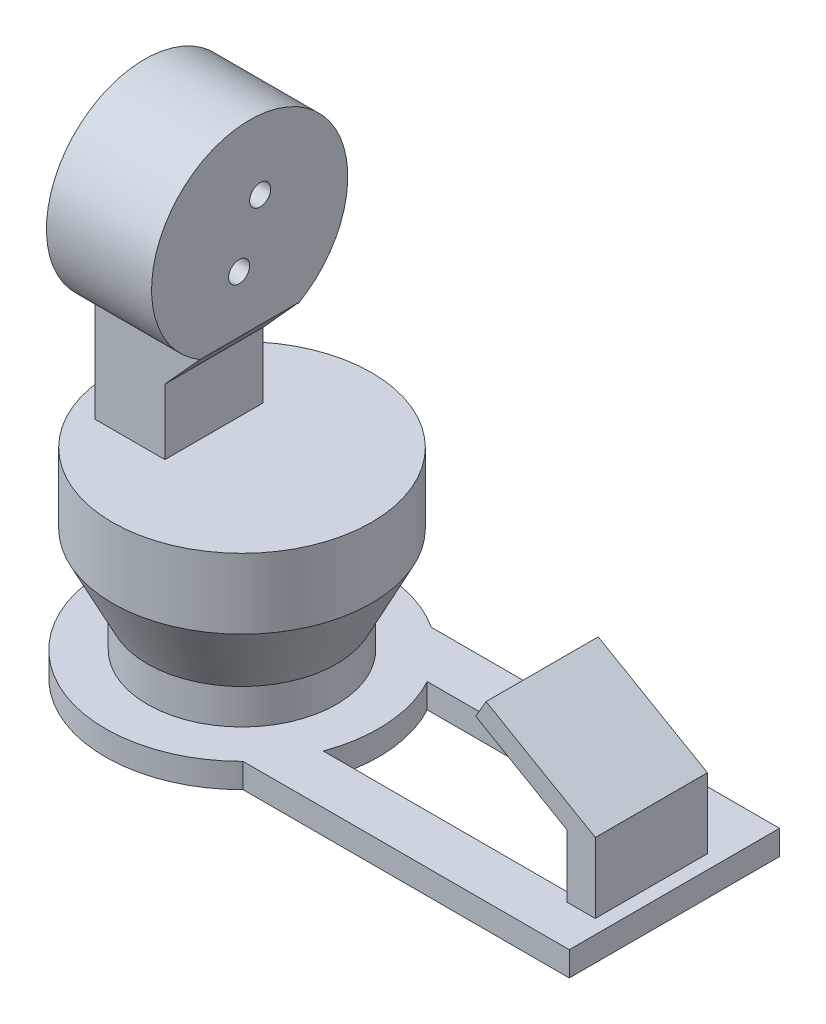
ISO-10303-21;
HEADER;
FILE_DESCRIPTION(('STEP AP214'),'2;1');
FILE_NAME('part.step','',(''),(''),'','','');
FILE_SCHEMA(('AUTOMOTIVE_DESIGN { 1 0 10303 214 1 1 1 1 }'));
ENDSEC;
DATA;
#1=APPLICATION_CONTEXT('core data for automotive mechanical design processes');
#2=APPLICATION_PROTOCOL_DEFINITION('international standard','automotive_design',2000,#1);
#3=PRODUCT_CONTEXT('',#1,'mechanical');
#4=PRODUCT('Part','Part','',(#3));
#5=PRODUCT_RELATED_PRODUCT_CATEGORY('part','',(#4));
#6=PRODUCT_DEFINITION_FORMATION('','',#4);
#7=PRODUCT_DEFINITION_CONTEXT('part definition',#1,'design');
#8=PRODUCT_DEFINITION('design','',#6,#7);
#9=PRODUCT_DEFINITION_SHAPE('','',#8);
#10=(LENGTH_UNIT() NAMED_UNIT(*) SI_UNIT(.MILLI.,.METRE.));
#11=(NAMED_UNIT(*) PLANE_ANGLE_UNIT() SI_UNIT($,.RADIAN.));
#12=(NAMED_UNIT(*) SI_UNIT($,.STERADIAN.) SOLID_ANGLE_UNIT());
#13=UNCERTAINTY_MEASURE_WITH_UNIT(LENGTH_MEASURE(1.E-05),#10,'distance_accuracy_value','');
#14=(GEOMETRIC_REPRESENTATION_CONTEXT(3) GLOBAL_UNCERTAINTY_ASSIGNED_CONTEXT((#13)) GLOBAL_UNIT_ASSIGNED_CONTEXT((#10,
#11,#12)) REPRESENTATION_CONTEXT('',''));
#15=CARTESIAN_POINT('',(0.,0.,0.));
#16=DIRECTION('',(0.,0.,1.));
#17=DIRECTION('',(1.,0.,0.));
#18=AXIS2_PLACEMENT_3D('',#15,#16,#17);
#19=CARTESIAN_POINT('',(0.,28.5,0.));
#20=DIRECTION('',(0.,1.,0.));
#21=DIRECTION('',(0.,0.,1.));
#22=AXIS2_PLACEMENT_3D('',#19,#20,#21);
#23=PLANE('',#22);
#24=CARTESIAN_POINT('',(0.,28.5,0.));
#25=DIRECTION('',(0.,1.,0.));
#26=DIRECTION('',(0.,0.,1.));
#27=AXIS2_PLACEMENT_3D('',#24,#25,#26);
#28=CIRCLE('',#27,18.5);
#29=CARTESIAN_POINT('',(0.,28.5,18.5));
#30=VERTEX_POINT('',#29);
#31=EDGE_CURVE('E269',#30,#30,#28,.T.);
#32=ORIENTED_EDGE('',*,*,#31,.T.);
#33=EDGE_LOOP('',(#32));
#34=FACE_BOUND('',#33,.T.);
#35=DIRECTION('',(1.,0.,0.));
#36=VECTOR('',#35,1.);
#37=CARTESIAN_POINT('',(-13.9958954436756,28.5,7.));
#38=LINE('',#37,#36);
#39=CARTESIAN_POINT('',(-13.9958954436756,28.5,7.));
#40=VERTEX_POINT('',#39);
#41=CARTESIAN_POINT('',(-3.99589544367561,28.5,7.));
#42=VERTEX_POINT('',#41);
#43=EDGE_CURVE('E257',#40,#42,#38,.T.);
#44=ORIENTED_EDGE('',*,*,#43,.F.);
#45=DIRECTION('',(0.,0.,1.));
#46=VECTOR('',#45,1.);
#47=CARTESIAN_POINT('',(-13.9958954436756,28.5,-7.));
#48=LINE('',#47,#46);
#49=CARTESIAN_POINT('',(-13.9958954436756,28.5,-7.));
#50=VERTEX_POINT('',#49);
#51=EDGE_CURVE('E249',#50,#40,#48,.T.);
#52=ORIENTED_EDGE('',*,*,#51,.F.);
#53=DIRECTION('',(-1.,0.,0.));
#54=VECTOR('',#53,1.);
#55=CARTESIAN_POINT('',(-13.9958954436756,28.5,-7.));
#56=LINE('',#55,#54);
#57=CARTESIAN_POINT('',(-3.99589544367561,28.5,-7.));
#58=VERTEX_POINT('',#57);
#59=EDGE_CURVE('E254',#58,#50,#56,.T.);
#60=ORIENTED_EDGE('',*,*,#59,.F.);
#61=DIRECTION('',(0.,0.,-1.));
#62=VECTOR('',#61,1.);
#63=CARTESIAN_POINT('',(-3.99589544367561,28.5,-7.));
#64=LINE('',#63,#62);
#65=EDGE_CURVE('E259',#42,#58,#64,.T.);
#66=ORIENTED_EDGE('',*,*,#65,.F.);
#67=EDGE_LOOP('',(#44,#52,#60,#66));
#68=FACE_BOUND('',#67,.T.);
#69=ADVANCED_FACE('F40',(#34,#68),#23,.T.);
#70=CARTESIAN_POINT('',(0.,3.5,0.));
#71=DIRECTION('',(0.,-1.,0.));
#72=DIRECTION('',(0.,0.,-1.));
#73=AXIS2_PLACEMENT_3D('',#70,#71,#72);
#74=CYLINDRICAL_SURFACE('',#73,19.5);
#75=CARTESIAN_POINT('',(0.,0.,0.));
#76=DIRECTION('',(0.,1.,0.));
#77=DIRECTION('',(0.,0.,1.));
#78=AXIS2_PLACEMENT_3D('',#75,#76,#77);
#79=CIRCLE('',#78,19.5);
#80=CARTESIAN_POINT('',(10.7209559253568,0.,-16.2883732780949));
#81=VERTEX_POINT('',#80);
#82=CARTESIAN_POINT('',(13.8651106248431,0.,13.7116267219051));
#83=VERTEX_POINT('',#82);
#84=EDGE_CURVE('E472',#81,#83,#79,.T.);
#85=ORIENTED_EDGE('',*,*,#84,.T.);
#86=DIRECTION('',(0.,-1.,0.));
#87=VECTOR('',#86,1.);
#88=CARTESIAN_POINT('',(13.8651106248431,3.5,13.7116267219051));
#89=LINE('',#88,#87);
#90=CARTESIAN_POINT('',(13.8651106248431,3.5,13.7116267219051));
#91=VERTEX_POINT('',#90);
#92=EDGE_CURVE('E12',#91,#83,#89,.T.);
#93=ORIENTED_EDGE('',*,*,#92,.F.);
#94=CARTESIAN_POINT('',(0.,3.5,0.));
#95=DIRECTION('',(0.,1.,0.));
#96=DIRECTION('',(0.,0.,1.));
#97=AXIS2_PLACEMENT_3D('',#94,#95,#96);
#98=CIRCLE('',#97,19.5);
#99=CARTESIAN_POINT('',(10.7209559253568,3.5,-16.2883732780949));
#100=VERTEX_POINT('',#99);
#101=EDGE_CURVE('E490',#100,#91,#98,.T.);
#102=ORIENTED_EDGE('',*,*,#101,.F.);
#103=DIRECTION('',(0.,-1.,0.));
#104=VECTOR('',#103,1.);
#105=CARTESIAN_POINT('',(10.7209559253568,3.5,-16.2883732780949));
#106=LINE('',#105,#104);
#107=EDGE_CURVE('E448',#100,#81,#106,.T.);
#108=ORIENTED_EDGE('',*,*,#107,.T.);
#109=EDGE_LOOP('',(#85,#93,#102,#108));
#110=FACE_BOUND('',#109,.T.);
#111=ADVANCED_FACE('F320',(#110),#74,.T.);
#112=CARTESIAN_POINT('',(0.,3.5,13.7116267219051));
#113=DIRECTION('',(0.,0.,1.));
#114=DIRECTION('',(1.,0.,0.));
#115=AXIS2_PLACEMENT_3D('',#112,#113,#114);
#116=PLANE('',#115);
#117=DIRECTION('',(-1.,0.,0.));
#118=VECTOR('',#117,1.);
#119=CARTESIAN_POINT('',(0.,0.,13.7116267219051));
#120=LINE('',#119,#118);
#121=CARTESIAN_POINT('',(60.4126112827152,0.,13.7116267219051));
#122=VERTEX_POINT('',#121);
#123=EDGE_CURVE('E469',#122,#83,#120,.T.);
#124=ORIENTED_EDGE('',*,*,#123,.F.);
#125=DIRECTION('',(0.,-1.,0.));
#126=VECTOR('',#125,1.);
#127=CARTESIAN_POINT('',(60.4126112827152,3.5,13.7116267219051));
#128=LINE('',#127,#126);
#129=CARTESIAN_POINT('',(60.4126112827152,3.5,13.7116267219051));
#130=VERTEX_POINT('',#129);
#131=EDGE_CURVE('E49',#130,#122,#128,.T.);
#132=ORIENTED_EDGE('',*,*,#131,.F.);
#133=DIRECTION('',(-1.,0.,0.));
#134=VECTOR('',#133,1.);
#135=CARTESIAN_POINT('',(0.,3.5,13.7116267219051));
#136=LINE('',#135,#134);
#137=EDGE_CURVE('E487',#130,#91,#136,.T.);
#138=ORIENTED_EDGE('',*,*,#137,.T.);
#139=ORIENTED_EDGE('',*,*,#92,.T.);
#140=EDGE_LOOP('',(#124,#132,#138,#139));
#141=FACE_BOUND('',#140,.T.);
#142=ADVANCED_FACE('F316',(#141),#116,.T.);
#143=CARTESIAN_POINT('',(60.4126112827152,3.5,0.));
#144=DIRECTION('',(-1.,0.,0.));
#145=DIRECTION('',(0.,0.,1.));
#146=AXIS2_PLACEMENT_3D('',#143,#144,#145);
#147=PLANE('',#146);
#148=DIRECTION('',(0.,0.,-1.));
#149=VECTOR('',#148,1.);
#150=CARTESIAN_POINT('',(60.4126112827152,0.,0.));
#151=LINE('',#150,#149);
#152=CARTESIAN_POINT('',(60.4126112827152,0.,-16.2883732780949));
#153=VERTEX_POINT('',#152);
#154=EDGE_CURVE('E467',#122,#153,#151,.T.);
#155=ORIENTED_EDGE('',*,*,#154,.T.);
#156=DIRECTION('',(0.,-1.,0.));
#157=VECTOR('',#156,1.);
#158=CARTESIAN_POINT('',(60.4126112827152,3.5,-16.2883732780949));
#159=LINE('',#158,#157);
#160=CARTESIAN_POINT('',(60.4126112827152,3.5,-16.2883732780949));
#161=VERTEX_POINT('',#160);
#162=EDGE_CURVE('E459',#161,#153,#159,.T.);
#163=ORIENTED_EDGE('',*,*,#162,.F.);
#164=DIRECTION('',(0.,0.,-1.));
#165=VECTOR('',#164,1.);
#166=CARTESIAN_POINT('',(60.4126112827152,3.5,0.));
#167=LINE('',#166,#165);
#168=EDGE_CURVE('E485',#130,#161,#167,.T.);
#169=ORIENTED_EDGE('',*,*,#168,.F.);
#170=ORIENTED_EDGE('',*,*,#131,.T.);
#171=EDGE_LOOP('',(#155,#163,#169,#170));
#172=FACE_BOUND('',#171,.T.);
#173=ADVANCED_FACE('F313',(#172),#147,.F.);
#174=CARTESIAN_POINT('',(0.,3.5,6.71162672190509));
#175=DIRECTION('',(0.,0.,-1.));
#176=DIRECTION('',(-1.,0.,0.));
#177=AXIS2_PLACEMENT_3D('',#174,#175,#176);
#178=PLANE('',#177);
#179=DIRECTION('',(1.,0.,0.));
#180=VECTOR('',#179,1.);
#181=CARTESIAN_POINT('',(0.,0.,6.71162672190509));
#182=LINE('',#181,#180);
#183=CARTESIAN_POINT('',(18.3085790476981,0.,6.71162672190509));
#184=VERTEX_POINT('',#183);
#185=CARTESIAN_POINT('',(53.4126112827152,0.,6.71162672190509));
#186=VERTEX_POINT('',#185);
#187=EDGE_CURVE('E445',#184,#186,#182,.T.);
#188=ORIENTED_EDGE('',*,*,#187,.F.);
#189=DIRECTION('',(0.,-1.,0.));
#190=VECTOR('',#189,1.);
#191=CARTESIAN_POINT('',(18.3085790476981,3.5,6.71162672190509));
#192=LINE('',#191,#190);
#193=CARTESIAN_POINT('',(18.3085790476981,3.5,6.71162672190509));
#194=VERTEX_POINT('',#193);
#195=EDGE_CURVE('E446',#194,#184,#192,.T.);
#196=ORIENTED_EDGE('',*,*,#195,.F.);
#197=DIRECTION('',(1.,0.,0.));
#198=VECTOR('',#197,1.);
#199=CARTESIAN_POINT('',(0.,3.5,6.71162672190509));
#200=LINE('',#199,#198);
#201=CARTESIAN_POINT('',(53.4126112827152,3.5,6.71162672190509));
#202=VERTEX_POINT('',#201);
#203=EDGE_CURVE('E466',#194,#202,#200,.T.);
#204=ORIENTED_EDGE('',*,*,#203,.T.);
#205=DIRECTION('',(0.,-1.,0.));
#206=VECTOR('',#205,1.);
#207=CARTESIAN_POINT('',(53.4126112827152,3.5,6.71162672190509));
#208=LINE('',#207,#206);
#209=EDGE_CURVE('E455',#202,#186,#208,.T.);
#210=ORIENTED_EDGE('',*,*,#209,.T.);
#211=EDGE_LOOP('',(#188,#196,#204,#210));
#212=FACE_BOUND('',#211,.T.);
#213=ADVANCED_FACE('F42',(#212),#178,.T.);
#214=CARTESIAN_POINT('',(0.,3.5,0.));
#215=DIRECTION('',(0.,-1.,0.));
#216=DIRECTION('',(0.,0.,-1.));
#217=AXIS2_PLACEMENT_3D('',#214,#215,#216);
#218=CYLINDRICAL_SURFACE('',#217,19.5);
#219=CARTESIAN_POINT('',(0.,0.,0.));
#220=DIRECTION('',(0.,1.,0.));
#221=DIRECTION('',(0.,0.,1.));
#222=AXIS2_PLACEMENT_3D('',#219,#220,#221);
#223=CIRCLE('',#222,19.5);
#224=CARTESIAN_POINT('',(17.1457318842554,0.,-9.28837327809491));
#225=VERTEX_POINT('',#224);
#226=EDGE_CURVE('E480',#184,#225,#223,.T.);
#227=ORIENTED_EDGE('',*,*,#226,.T.);
#228=DIRECTION('',(0.,-1.,0.));
#229=VECTOR('',#228,1.);
#230=CARTESIAN_POINT('',(17.1457318842554,3.5,-9.28837327809491));
#231=LINE('',#230,#229);
#232=CARTESIAN_POINT('',(17.1457318842554,3.5,-9.28837327809491));
#233=VERTEX_POINT('',#232);
#234=EDGE_CURVE('E449',#233,#225,#231,.T.);
#235=ORIENTED_EDGE('',*,*,#234,.F.);
#236=CARTESIAN_POINT('',(0.,3.5,0.));
#237=DIRECTION('',(0.,1.,0.));
#238=DIRECTION('',(0.,0.,1.));
#239=AXIS2_PLACEMENT_3D('',#236,#237,#238);
#240=CIRCLE('',#239,19.5);
#241=EDGE_CURVE('E496',#194,#233,#240,.T.);
#242=ORIENTED_EDGE('',*,*,#241,.F.);
#243=ORIENTED_EDGE('',*,*,#195,.T.);
#244=EDGE_LOOP('',(#227,#235,#242,#243));
#245=FACE_BOUND('',#244,.T.);
#246=ADVANCED_FACE('F330',(#245),#218,.T.);
#247=CARTESIAN_POINT('',(0.,3.5,-9.28837327809491));
#248=DIRECTION('',(0.,0.,-1.));
#249=DIRECTION('',(-1.,0.,0.));
#250=AXIS2_PLACEMENT_3D('',#247,#248,#249);
#251=PLANE('',#250);
#252=DIRECTION('',(1.,0.,0.));
#253=VECTOR('',#252,1.);
#254=CARTESIAN_POINT('',(0.,0.,-9.28837327809491));
#255=LINE('',#254,#253);
#256=CARTESIAN_POINT('',(53.4126112827152,0.,-9.28837327809491));
#257=VERTEX_POINT('',#256);
#258=EDGE_CURVE('E478',#225,#257,#255,.T.);
#259=ORIENTED_EDGE('',*,*,#258,.T.);
#260=DIRECTION('',(0.,-1.,0.));
#261=VECTOR('',#260,1.);
#262=CARTESIAN_POINT('',(53.4126112827152,3.5,-9.28837327809491));
#263=LINE('',#262,#261);
#264=CARTESIAN_POINT('',(53.4126112827152,3.5,-9.28837327809491));
#265=VERTEX_POINT('',#264);
#266=EDGE_CURVE('E452',#265,#257,#263,.T.);
#267=ORIENTED_EDGE('',*,*,#266,.F.);
#268=DIRECTION('',(1.,0.,0.));
#269=VECTOR('',#268,1.);
#270=CARTESIAN_POINT('',(0.,3.5,-9.28837327809491));
#271=LINE('',#270,#269);
#272=EDGE_CURVE('E494',#233,#265,#271,.T.);
#273=ORIENTED_EDGE('',*,*,#272,.F.);
#274=ORIENTED_EDGE('',*,*,#234,.T.);
#275=EDGE_LOOP('',(#259,#267,#273,#274));
#276=FACE_BOUND('',#275,.T.);
#277=ADVANCED_FACE('F327',(#276),#251,.F.);
#278=CARTESIAN_POINT('',(53.4126112827152,3.5,0.));
#279=DIRECTION('',(1.,0.,0.));
#280=DIRECTION('',(0.,0.,-1.));
#281=AXIS2_PLACEMENT_3D('',#278,#279,#280);
#282=PLANE('',#281);
#283=DIRECTION('',(0.,0.,1.));
#284=VECTOR('',#283,1.);
#285=CARTESIAN_POINT('',(53.4126112827152,0.,0.));
#286=LINE('',#285,#284);
#287=EDGE_CURVE('E475',#257,#186,#286,.T.);
#288=ORIENTED_EDGE('',*,*,#287,.T.);
#289=ORIENTED_EDGE('',*,*,#209,.F.);
#290=DIRECTION('',(0.,0.,1.));
#291=VECTOR('',#290,1.);
#292=CARTESIAN_POINT('',(53.4126112827152,3.5,0.));
#293=LINE('',#292,#291);
#294=EDGE_CURVE('E492',#265,#202,#293,.T.);
#295=ORIENTED_EDGE('',*,*,#294,.F.);
#296=ORIENTED_EDGE('',*,*,#266,.T.);
#297=EDGE_LOOP('',(#288,#289,#295,#296));
#298=FACE_BOUND('',#297,.T.);
#299=ADVANCED_FACE('F311',(#298),#282,.F.);
#300=CARTESIAN_POINT('',(0.,3.5,-16.2883732780949));
#301=DIRECTION('',(0.,0.,1.));
#302=DIRECTION('',(1.,0.,0.));
#303=AXIS2_PLACEMENT_3D('',#300,#301,#302);
#304=PLANE('',#303);
#305=DIRECTION('',(-1.,0.,0.));
#306=VECTOR('',#305,1.);
#307=CARTESIAN_POINT('',(0.,0.,-16.2883732780949));
#308=LINE('',#307,#306);
#309=EDGE_CURVE('E464',#153,#81,#308,.T.);
#310=ORIENTED_EDGE('',*,*,#309,.T.);
#311=ORIENTED_EDGE('',*,*,#107,.F.);
#312=DIRECTION('',(-1.,0.,0.));
#313=VECTOR('',#312,1.);
#314=CARTESIAN_POINT('',(0.,3.5,-16.2883732780949));
#315=LINE('',#314,#313);
#316=EDGE_CURVE('E456',#161,#100,#315,.T.);
#317=ORIENTED_EDGE('',*,*,#316,.F.);
#318=ORIENTED_EDGE('',*,*,#162,.T.);
#319=EDGE_LOOP('',(#310,#311,#317,#318));
#320=FACE_BOUND('',#319,.T.);
#321=ADVANCED_FACE('F304',(#320),#304,.F.);
#322=CARTESIAN_POINT('',(0.,3.5,0.));
#323=DIRECTION('',(0.,1.,0.));
#324=DIRECTION('',(0.,0.,1.));
#325=AXIS2_PLACEMENT_3D('',#322,#323,#324);
#326=PLANE('',#325);
#327=DIRECTION('',(1.,0.,0.));
#328=VECTOR('',#327,1.);
#329=CARTESIAN_POINT('',(58.4126112827152,3.5,8.));
#330=LINE('',#329,#328);
#331=CARTESIAN_POINT('',(54.4126112827152,3.5,8.));
#332=VERTEX_POINT('',#331);
#333=CARTESIAN_POINT('',(58.4126112827152,3.5,8.));
#334=VERTEX_POINT('',#333);
#335=EDGE_CURVE('E207',#332,#334,#330,.T.);
#336=ORIENTED_EDGE('',*,*,#335,.F.);
#337=DIRECTION('',(0.,0.,-1.));
#338=VECTOR('',#337,1.);
#339=CARTESIAN_POINT('',(54.4126112827152,3.5,8.));
#340=LINE('',#339,#338);
#341=CARTESIAN_POINT('',(54.4126112827152,3.5,-8.));
#342=VERTEX_POINT('',#341);
#343=EDGE_CURVE('E794',#332,#342,#340,.T.);
#344=ORIENTED_EDGE('',*,*,#343,.T.);
#345=DIRECTION('',(1.,0.,0.));
#346=VECTOR('',#345,1.);
#347=CARTESIAN_POINT('',(58.4126112827152,3.5,-8.));
#348=LINE('',#347,#346);
#349=CARTESIAN_POINT('',(58.4126112827152,3.5,-8.));
#350=VERTEX_POINT('',#349);
#351=EDGE_CURVE('E210',#342,#350,#348,.T.);
#352=ORIENTED_EDGE('',*,*,#351,.T.);
#353=DIRECTION('',(0.,0.,-1.));
#354=VECTOR('',#353,1.);
#355=CARTESIAN_POINT('',(58.4126112827152,3.5,8.));
#356=LINE('',#355,#354);
#357=EDGE_CURVE('E780',#334,#350,#356,.T.);
#358=ORIENTED_EDGE('',*,*,#357,.F.);
#359=EDGE_LOOP('',(#336,#344,#352,#358));
#360=FACE_BOUND('',#359,.T.);
#361=CARTESIAN_POINT('',(0.,3.5,0.));
#362=DIRECTION('',(0.,1.,0.));
#363=DIRECTION('',(0.,0.,1.));
#364=AXIS2_PLACEMENT_3D('',#361,#362,#363);
#365=CIRCLE('',#364,13.5);
#366=CARTESIAN_POINT('',(0.,3.5,13.5));
#367=VERTEX_POINT('',#366);
#368=EDGE_CURVE('E429',#367,#367,#365,.T.);
#369=ORIENTED_EDGE('',*,*,#368,.F.);
#370=EDGE_LOOP('',(#369));
#371=FACE_BOUND('',#370,.T.);
#372=ORIENTED_EDGE('',*,*,#203,.F.);
#373=ORIENTED_EDGE('',*,*,#241,.T.);
#374=ORIENTED_EDGE('',*,*,#272,.T.);
#375=ORIENTED_EDGE('',*,*,#294,.T.);
#376=EDGE_LOOP('',(#372,#373,#374,#375));
#377=FACE_BOUND('',#376,.T.);
#378=ORIENTED_EDGE('',*,*,#101,.T.);
#379=ORIENTED_EDGE('',*,*,#137,.F.);
#380=ORIENTED_EDGE('',*,*,#168,.T.);
#381=ORIENTED_EDGE('',*,*,#316,.T.);
#382=EDGE_LOOP('',(#378,#379,#380,#381));
#383=FACE_BOUND('',#382,.T.);
#384=ADVANCED_FACE('F301',(#360,#371,#377,#383),#326,.T.);
#385=CARTESIAN_POINT('',(0.,0.,0.));
#386=DIRECTION('',(0.,1.,0.));
#387=DIRECTION('',(0.,0.,1.));
#388=AXIS2_PLACEMENT_3D('',#385,#386,#387);
#389=PLANE('',#388);
#390=ORIENTED_EDGE('',*,*,#187,.T.);
#391=ORIENTED_EDGE('',*,*,#287,.F.);
#392=ORIENTED_EDGE('',*,*,#258,.F.);
#393=ORIENTED_EDGE('',*,*,#226,.F.);
#394=EDGE_LOOP('',(#390,#391,#392,#393));
#395=FACE_BOUND('',#394,.T.);
#396=ORIENTED_EDGE('',*,*,#84,.F.);
#397=ORIENTED_EDGE('',*,*,#309,.F.);
#398=ORIENTED_EDGE('',*,*,#154,.F.);
#399=ORIENTED_EDGE('',*,*,#123,.T.);
#400=EDGE_LOOP('',(#396,#397,#398,#399));
#401=FACE_BOUND('',#400,.T.);
#402=ADVANCED_FACE('F299',(#395,#401),#389,.F.);
#403=CARTESIAN_POINT('',(0.,8.5,0.));
#404=DIRECTION('',(0.,-1.,0.));
#405=DIRECTION('',(0.,0.,-1.));
#406=AXIS2_PLACEMENT_3D('',#403,#404,#405);
#407=CYLINDRICAL_SURFACE('',#406,13.5);
#408=CARTESIAN_POINT('',(0.,8.5,0.));
#409=DIRECTION('',(0.,1.,0.));
#410=DIRECTION('',(0.,0.,1.));
#411=AXIS2_PLACEMENT_3D('',#408,#409,#410);
#412=CIRCLE('',#411,13.5);
#413=CARTESIAN_POINT('',(0.,8.5,13.5));
#414=VERTEX_POINT('',#413);
#415=EDGE_CURVE('E442',#414,#414,#412,.T.);
#416=ORIENTED_EDGE('',*,*,#415,.F.);
#417=EDGE_LOOP('',(#416));
#418=FACE_BOUND('',#417,.T.);
#419=ORIENTED_EDGE('',*,*,#368,.T.);
#420=EDGE_LOOP('',(#419));
#421=FACE_BOUND('',#420,.T.);
#422=ADVANCED_FACE('F294',(#418,#421),#407,.T.);
#423=CARTESIAN_POINT('',(0.,8.5,0.));
#424=DIRECTION('',(0.,1.,0.));
#425=DIRECTION('',(0.,0.,1.));
#426=AXIS2_PLACEMENT_3D('',#423,#424,#425);
#427=CONICAL_SURFACE('',#426,13.5,0.463647609000806);
#428=CARTESIAN_POINT('',(0.,18.5,0.));
#429=DIRECTION('',(0.,1.,0.));
#430=DIRECTION('',(0.,0.,1.));
#431=AXIS2_PLACEMENT_3D('',#428,#429,#430);
#432=CIRCLE('',#431,18.5);
#433=CARTESIAN_POINT('',(0.,18.5,18.5));
#434=VERTEX_POINT('',#433);
#435=EDGE_CURVE('E272',#434,#434,#432,.T.);
#436=ORIENTED_EDGE('',*,*,#435,.F.);
#437=EDGE_LOOP('',(#436));
#438=FACE_BOUND('',#437,.T.);
#439=ORIENTED_EDGE('',*,*,#415,.T.);
#440=EDGE_LOOP('',(#439));
#441=FACE_BOUND('',#440,.T.);
#442=ADVANCED_FACE('F283',(#438,#441),#427,.T.);
#443=CARTESIAN_POINT('',(0.,28.5,0.));
#444=DIRECTION('',(0.,-1.,0.));
#445=DIRECTION('',(0.,0.,-1.));
#446=AXIS2_PLACEMENT_3D('',#443,#444,#445);
#447=CYLINDRICAL_SURFACE('',#446,18.5);
#448=ORIENTED_EDGE('',*,*,#31,.F.);
#449=EDGE_LOOP('',(#448));
#450=FACE_BOUND('',#449,.T.);
#451=ORIENTED_EDGE('',*,*,#435,.T.);
#452=EDGE_LOOP('',(#451));
#453=FACE_BOUND('',#452,.T.);
#454=ADVANCED_FACE('F293',(#450,#453),#447,.T.);
#455=CARTESIAN_POINT('',(-13.9958954436756,37.835,-7.));
#456=DIRECTION('',(1.,0.,0.));
#457=DIRECTION('',(0.,0.,-1.));
#458=AXIS2_PLACEMENT_3D('',#455,#456,#457);
#459=PLANE('',#458);
#460=CARTESIAN_POINT('',(-13.9958954436756,59.43404860374,-1.59167118643871));
#461=DIRECTION('',(-1.,0.,0.));
#462=DIRECTION('',(0.,0.,1.));
#463=AXIS2_PLACEMENT_3D('',#460,#461,#462);
#464=CIRCLE('',#463,1.5);
#465=CARTESIAN_POINT('',(-13.9958954436756,59.43404860374,-0.0916711864387128));
#466=VERTEX_POINT('',#465);
#467=EDGE_CURVE('E416',#466,#466,#464,.T.);
#468=ORIENTED_EDGE('',*,*,#467,.F.);
#469=EDGE_LOOP('',(#468));
#470=FACE_BOUND('',#469,.T.);
#471=CARTESIAN_POINT('',(-13.9958954436756,51.43404860374,1.40832881356129));
#472=DIRECTION('',(-1.,0.,0.));
#473=DIRECTION('',(0.,0.,1.));
#474=AXIS2_PLACEMENT_3D('',#471,#472,#473);
#475=CIRCLE('',#474,1.5);
#476=CARTESIAN_POINT('',(-13.9958954436756,51.43404860374,2.90832881356129));
#477=VERTEX_POINT('',#476);
#478=EDGE_CURVE('E425',#477,#477,#475,.T.);
#479=ORIENTED_EDGE('',*,*,#478,.F.);
#480=EDGE_LOOP('',(#479));
#481=FACE_BOUND('',#480,.T.);
#482=DIRECTION('',(0.,-1.,0.));
#483=VECTOR('',#482,1.);
#484=CARTESIAN_POINT('',(-13.9958954436756,37.835,7.));
#485=LINE('',#484,#483);
#486=CARTESIAN_POINT('',(-13.9958954436756,43.3630834483171,7.));
#487=VERTEX_POINT('',#486);
#488=EDGE_CURVE('E267',#487,#40,#485,.T.);
#489=ORIENTED_EDGE('',*,*,#488,.F.);
#490=CARTESIAN_POINT('',(-13.9958954436756,55.43404860374,-0.0916711864387132));
#491=DIRECTION('',(-1.,0.,0.));
#492=DIRECTION('',(0.,0.,1.));
#493=AXIS2_PLACEMENT_3D('',#490,#491,#492);
#494=CIRCLE('',#493,14.);
#495=CARTESIAN_POINT('',(-13.9958954436756,43.2572266454572,-7.));
#496=VERTEX_POINT('',#495);
#497=EDGE_CURVE('E213',#487,#496,#494,.T.);
#498=ORIENTED_EDGE('',*,*,#497,.T.);
#499=DIRECTION('',(0.,-1.,0.));
#500=VECTOR('',#499,1.);
#501=CARTESIAN_POINT('',(-13.9958954436756,37.835,-7.));
#502=LINE('',#501,#500);
#503=EDGE_CURVE('E253',#496,#50,#502,.T.);
#504=ORIENTED_EDGE('',*,*,#503,.T.);
#505=ORIENTED_EDGE('',*,*,#51,.T.);
#506=EDGE_LOOP('',(#489,#498,#504,#505));
#507=FACE_BOUND('',#506,.T.);
#508=ADVANCED_FACE('F344',(#470,#481,#507),#459,.F.);
#509=CARTESIAN_POINT('',(-13.9958954436756,37.835,7.));
#510=DIRECTION('',(0.,0.,-1.));
#511=DIRECTION('',(-1.,0.,0.));
#512=AXIS2_PLACEMENT_3D('',#509,#510,#511);
#513=PLANE('',#512);
#514=DIRECTION('',(0.670667431452126,0.741758179186052,0.));
#515=VECTOR('',#514,1.);
#516=CARTESIAN_POINT('',(1.00410455632439,43.365,7.));
#517=LINE('',#516,#515);
#518=CARTESIAN_POINT('',(-3.99589544367561,37.835,7.));
#519=VERTEX_POINT('',#518);
#520=CARTESIAN_POINT('',(1.00237168861833,43.3630834483171,7.));
#521=VERTEX_POINT('',#520);
#522=EDGE_CURVE('E242',#519,#521,#517,.T.);
#523=ORIENTED_EDGE('',*,*,#522,.T.);
#524=DIRECTION('',(-1.,0.,0.));
#525=VECTOR('',#524,1.);
#526=CARTESIAN_POINT('',(1.00410455632439,43.3630834483171,7.));
#527=LINE('',#526,#525);
#528=EDGE_CURVE('E228',#521,#487,#527,.T.);
#529=ORIENTED_EDGE('',*,*,#528,.T.);
#530=ORIENTED_EDGE('',*,*,#488,.T.);
#531=ORIENTED_EDGE('',*,*,#43,.T.);
#532=DIRECTION('',(0.,-1.,0.));
#533=VECTOR('',#532,1.);
#534=CARTESIAN_POINT('',(-3.99589544367561,37.835,7.));
#535=LINE('',#534,#533);
#536=EDGE_CURVE('E264',#519,#42,#535,.T.);
#537=ORIENTED_EDGE('',*,*,#536,.F.);
#538=EDGE_LOOP('',(#523,#529,#530,#531,#537));
#539=FACE_BOUND('',#538,.T.);
#540=ADVANCED_FACE('F347',(#539),#513,.F.);
#541=CARTESIAN_POINT('',(-3.99589544367561,37.835,-7.));
#542=DIRECTION('',(-1.,0.,0.));
#543=DIRECTION('',(0.,0.,1.));
#544=AXIS2_PLACEMENT_3D('',#541,#542,#543);
#545=PLANE('',#544);
#546=ORIENTED_EDGE('',*,*,#65,.T.);
#547=DIRECTION('',(0.,-1.,0.));
#548=VECTOR('',#547,1.);
#549=CARTESIAN_POINT('',(-3.99589544367561,37.835,-7.));
#550=LINE('',#549,#548);
#551=CARTESIAN_POINT('',(-3.99589544367561,37.835,-7.));
#552=VERTEX_POINT('',#551);
#553=EDGE_CURVE('E65',#552,#58,#550,.T.);
#554=ORIENTED_EDGE('',*,*,#553,.F.);
#555=DIRECTION('',(0.,0.,-1.));
#556=VECTOR('',#555,1.);
#557=CARTESIAN_POINT('',(-3.99589544367561,37.835,-7.));
#558=LINE('',#557,#556);
#559=EDGE_CURVE('E250',#519,#552,#558,.T.);
#560=ORIENTED_EDGE('',*,*,#559,.F.);
#561=ORIENTED_EDGE('',*,*,#536,.T.);
#562=EDGE_LOOP('',(#546,#554,#560,#561));
#563=FACE_BOUND('',#562,.T.);
#564=ADVANCED_FACE('F351',(#563),#545,.F.);
#565=CARTESIAN_POINT('',(-13.9958954436756,37.835,-7.));
#566=DIRECTION('',(0.,0.,1.));
#567=DIRECTION('',(1.,0.,0.));
#568=AXIS2_PLACEMENT_3D('',#565,#566,#567);
#569=PLANE('',#568);
#570=ORIENTED_EDGE('',*,*,#503,.F.);
#571=DIRECTION('',(-1.,0.,0.));
#572=VECTOR('',#571,1.);
#573=CARTESIAN_POINT('',(1.00410455632439,43.2572266454572,-7.));
#574=LINE('',#573,#572);
#575=CARTESIAN_POINT('',(0.906660293627466,43.2572266454572,-7.));
#576=VERTEX_POINT('',#575);
#577=EDGE_CURVE('E234',#576,#496,#574,.T.);
#578=ORIENTED_EDGE('',*,*,#577,.F.);
#579=DIRECTION('',(0.670667431452126,0.741758179186052,0.));
#580=VECTOR('',#579,1.);
#581=CARTESIAN_POINT('',(1.00410455632439,43.365,-7.));
#582=LINE('',#581,#580);
#583=EDGE_CURVE('E241',#552,#576,#582,.T.);
#584=ORIENTED_EDGE('',*,*,#583,.F.);
#585=ORIENTED_EDGE('',*,*,#553,.T.);
#586=ORIENTED_EDGE('',*,*,#59,.T.);
#587=EDGE_LOOP('',(#570,#578,#584,#585,#586));
#588=FACE_BOUND('',#587,.T.);
#589=ADVANCED_FACE('F355',(#588),#569,.F.);
#590=CARTESIAN_POINT('',(1.00410455632439,43.365,7.));
#591=DIRECTION('',(-0.741758179186052,0.670667431452127,0.));
#592=DIRECTION('',(-0.670667431452127,-0.741758179186052,0.));
#593=AXIS2_PLACEMENT_3D('',#590,#591,#592);
#594=PLANE('',#593);
#595=ORIENTED_EDGE('',*,*,#583,.T.);
#596=DIRECTION('',(-0.670667431452127,-0.741758179186052,0.));
#597=VECTOR('',#596,1.);
#598=CARTESIAN_POINT('',(1.00410455632439,43.365,-7.));
#599=LINE('',#598,#597);
#600=CARTESIAN_POINT('',(1.00410455632439,43.365,-7.));
#601=VERTEX_POINT('',#600);
#602=EDGE_CURVE('E233',#601,#576,#599,.T.);
#603=ORIENTED_EDGE('',*,*,#602,.F.);
#604=DIRECTION('',(0.,0.,-1.));
#605=VECTOR('',#604,1.);
#606=CARTESIAN_POINT('',(1.00410455632439,43.365,7.));
#607=LINE('',#606,#605);
#608=CARTESIAN_POINT('',(1.00410455632439,43.365,7.));
#609=VERTEX_POINT('',#608);
#610=EDGE_CURVE('E245',#609,#601,#607,.T.);
#611=ORIENTED_EDGE('',*,*,#610,.F.);
#612=DIRECTION('',(0.670667431452127,0.741758179186052,0.));
#613=VECTOR('',#612,1.);
#614=CARTESIAN_POINT('',(1.00410455632439,43.365,7.));
#615=LINE('',#614,#613);
#616=EDGE_CURVE('E239',#521,#609,#615,.T.);
#617=ORIENTED_EDGE('',*,*,#616,.F.);
#618=ORIENTED_EDGE('',*,*,#522,.F.);
#619=ORIENTED_EDGE('',*,*,#559,.T.);
#620=EDGE_LOOP('',(#595,#603,#611,#617,#618,#619));
#621=FACE_BOUND('',#620,.T.);
#622=ADVANCED_FACE('F359',(#621),#594,.F.);
#623=CARTESIAN_POINT('',(1.00410455632439,0.,7.));
#624=DIRECTION('',(0.,0.,1.));
#625=DIRECTION('',(1.,0.,0.));
#626=AXIS2_PLACEMENT_3D('',#623,#624,#625);
#627=PLANE('',#626);
#628=CARTESIAN_POINT('',(1.00410455632439,43.3630834483171,7.));
#629=VERTEX_POINT('',#628);
#630=EDGE_CURVE('E235',#629,#521,#527,.T.);
#631=ORIENTED_EDGE('',*,*,#630,.T.);
#632=ORIENTED_EDGE('',*,*,#616,.T.);
#633=DIRECTION('',(0.,1.,0.));
#634=VECTOR('',#633,1.);
#635=CARTESIAN_POINT('',(1.00410455632439,0.,7.));
#636=LINE('',#635,#634);
#637=EDGE_CURVE('E216',#629,#609,#636,.T.);
#638=ORIENTED_EDGE('',*,*,#637,.F.);
#639=EDGE_LOOP('',(#631,#632,#638));
#640=FACE_BOUND('',#639,.T.);
#641=ADVANCED_FACE('F362',(#640),#627,.F.);
#642=CARTESIAN_POINT('',(1.00410455632439,0.,-7.));
#643=DIRECTION('',(0.,0.,-1.));
#644=DIRECTION('',(-1.,0.,0.));
#645=AXIS2_PLACEMENT_3D('',#642,#643,#644);
#646=PLANE('',#645);
#647=DIRECTION('',(0.,-1.,0.));
#648=VECTOR('',#647,1.);
#649=CARTESIAN_POINT('',(1.00410455632439,0.,-7.));
#650=LINE('',#649,#648);
#651=CARTESIAN_POINT('',(1.00410455632439,43.2572266454572,-7.));
#652=VERTEX_POINT('',#651);
#653=EDGE_CURVE('E227',#601,#652,#650,.T.);
#654=ORIENTED_EDGE('',*,*,#653,.F.);
#655=ORIENTED_EDGE('',*,*,#602,.T.);
#656=EDGE_CURVE('E230',#652,#576,#574,.T.);
#657=ORIENTED_EDGE('',*,*,#656,.F.);
#658=EDGE_LOOP('',(#654,#655,#657));
#659=FACE_BOUND('',#658,.T.);
#660=ADVANCED_FACE('F366',(#659),#646,.F.);
#661=CARTESIAN_POINT('',(1.00410455632439,55.43404860374,-0.0916711864387132));
#662=DIRECTION('',(-1.,0.,0.));
#663=DIRECTION('',(0.,0.,1.));
#664=AXIS2_PLACEMENT_3D('',#661,#662,#663);
#665=CYLINDRICAL_SURFACE('',#664,14.);
#666=ORIENTED_EDGE('',*,*,#497,.F.);
#667=ORIENTED_EDGE('',*,*,#528,.F.);
#668=ORIENTED_EDGE('',*,*,#630,.F.);
#669=CARTESIAN_POINT('',(1.00410455632439,55.43404860374,-0.0916711864387132));
#670=DIRECTION('',(-1.,0.,0.));
#671=DIRECTION('',(0.,0.,1.));
#672=AXIS2_PLACEMENT_3D('',#669,#670,#671);
#673=CIRCLE('',#672,14.);
#674=EDGE_CURVE('E224',#629,#652,#673,.T.);
#675=ORIENTED_EDGE('',*,*,#674,.T.);
#676=ORIENTED_EDGE('',*,*,#656,.T.);
#677=ORIENTED_EDGE('',*,*,#577,.T.);
#678=EDGE_LOOP('',(#666,#667,#668,#675,#676,#677));
#679=FACE_BOUND('',#678,.T.);
#680=ADVANCED_FACE('F368',(#679),#665,.T.);
#681=CARTESIAN_POINT('',(1.00410455632439,0.,0.));
#682=DIRECTION('',(-1.,0.,0.));
#683=DIRECTION('',(0.,0.,1.));
#684=AXIS2_PLACEMENT_3D('',#681,#682,#683);
#685=PLANE('',#684);
#686=CARTESIAN_POINT('',(1.00410455632439,59.43404860374,-1.59167118643871));
#687=DIRECTION('',(-1.,0.,0.));
#688=DIRECTION('',(0.,0.,1.));
#689=AXIS2_PLACEMENT_3D('',#686,#687,#688);
#690=CIRCLE('',#689,1.5);
#691=CARTESIAN_POINT('',(1.00410455632439,59.43404860374,-0.0916711864387128));
#692=VERTEX_POINT('',#691);
#693=EDGE_CURVE('E44',#692,#692,#690,.T.);
#694=ORIENTED_EDGE('',*,*,#693,.T.);
#695=EDGE_LOOP('',(#694));
#696=FACE_BOUND('',#695,.T.);
#697=CARTESIAN_POINT('',(1.00410455632439,51.43404860374,1.40832881356129));
#698=DIRECTION('',(-1.,0.,0.));
#699=DIRECTION('',(0.,0.,1.));
#700=AXIS2_PLACEMENT_3D('',#697,#698,#699);
#701=CIRCLE('',#700,1.5);
#702=CARTESIAN_POINT('',(1.00410455632439,51.43404860374,2.90832881356129));
#703=VERTEX_POINT('',#702);
#704=EDGE_CURVE('E419',#703,#703,#701,.T.);
#705=ORIENTED_EDGE('',*,*,#704,.T.);
#706=EDGE_LOOP('',(#705));
#707=FACE_BOUND('',#706,.T.);
#708=ORIENTED_EDGE('',*,*,#637,.T.);
#709=ORIENTED_EDGE('',*,*,#610,.T.);
#710=ORIENTED_EDGE('',*,*,#653,.T.);
#711=ORIENTED_EDGE('',*,*,#674,.F.);
#712=EDGE_LOOP('',(#708,#709,#710,#711));
#713=FACE_BOUND('',#712,.T.);
#714=ADVANCED_FACE('F371',(#696,#707,#713),#685,.F.);
#715=CARTESIAN_POINT('',(58.4126112827152,3.5,8.));
#716=DIRECTION('',(-1.,0.,0.));
#717=DIRECTION('',(0.,0.,1.));
#718=AXIS2_PLACEMENT_3D('',#715,#716,#717);
#719=PLANE('',#718);
#720=DIRECTION('',(0.,1.,0.));
#721=VECTOR('',#720,1.);
#722=CARTESIAN_POINT('',(58.4126112827152,3.5,-8.));
#723=LINE('',#722,#721);
#724=CARTESIAN_POINT('',(58.4126112827152,13.5,-8.));
#725=VERTEX_POINT('',#724);
#726=EDGE_CURVE('E57',#350,#725,#723,.T.);
#727=ORIENTED_EDGE('',*,*,#726,.T.);
#728=DIRECTION('',(0.,0.,-1.));
#729=VECTOR('',#728,1.);
#730=CARTESIAN_POINT('',(58.4126112827152,13.5,8.));
#731=LINE('',#730,#729);
#732=CARTESIAN_POINT('',(58.4126112827152,13.5,8.));
#733=VERTEX_POINT('',#732);
#734=EDGE_CURVE('E196',#733,#725,#731,.T.);
#735=ORIENTED_EDGE('',*,*,#734,.F.);
#736=DIRECTION('',(0.,1.,0.));
#737=VECTOR('',#736,1.);
#738=CARTESIAN_POINT('',(58.4126112827152,3.5,8.));
#739=LINE('',#738,#737);
#740=EDGE_CURVE('E202',#334,#733,#739,.T.);
#741=ORIENTED_EDGE('',*,*,#740,.F.);
#742=ORIENTED_EDGE('',*,*,#357,.T.);
#743=EDGE_LOOP('',(#727,#735,#741,#742));
#744=FACE_BOUND('',#743,.T.);
#745=ADVANCED_FACE('F212',(#744),#719,.F.);
#746=CARTESIAN_POINT('',(58.4126112827152,13.5,8.));
#747=DIRECTION('',(-0.866025403784367,0.500000000000124,0.));
#748=DIRECTION('',(-0.500000000000124,-0.866025403784367,0.));
#749=AXIS2_PLACEMENT_3D('',#746,#747,#748);
#750=PLANE('',#749);
#751=DIRECTION('',(0.500000000000124,0.866025403784367,0.));
#752=VECTOR('',#751,1.);
#753=CARTESIAN_POINT('',(58.4126112827152,13.5,-8.));
#754=LINE('',#753,#752);
#755=CARTESIAN_POINT('',(58.4202792430722,13.5132812969287,-8.));
#756=VERTEX_POINT('',#755);
#757=EDGE_CURVE('E420',#725,#756,#754,.T.);
#758=ORIENTED_EDGE('',*,*,#757,.T.);
#759=DIRECTION('',(0.,0.,-1.));
#760=VECTOR('',#759,1.);
#761=CARTESIAN_POINT('',(58.4202792430722,13.5132812969287,8.));
#762=LINE('',#761,#760);
#763=CARTESIAN_POINT('',(58.4202792430722,13.5132812969287,8.));
#764=VERTEX_POINT('',#763);
#765=EDGE_CURVE('E198',#764,#756,#762,.T.);
#766=ORIENTED_EDGE('',*,*,#765,.F.);
#767=DIRECTION('',(0.500000000000124,0.866025403784367,0.));
#768=VECTOR('',#767,1.);
#769=CARTESIAN_POINT('',(58.4126112827152,13.5,8.));
#770=LINE('',#769,#768);
#771=EDGE_CURVE('E192',#733,#764,#770,.T.);
#772=ORIENTED_EDGE('',*,*,#771,.F.);
#773=ORIENTED_EDGE('',*,*,#734,.T.);
#774=EDGE_LOOP('',(#758,#766,#772,#773));
#775=FACE_BOUND('',#774,.T.);
#776=ADVANCED_FACE('F194',(#775),#750,.F.);
#777=CARTESIAN_POINT('',(58.4202792430722,13.5132812969287,8.));
#778=DIRECTION('',(-0.50000000000021,-0.866025403784317,0.));
#779=DIRECTION('',(0.866025403784317,-0.50000000000021,0.));
#780=AXIS2_PLACEMENT_3D('',#777,#778,#779);
#781=PLANE('',#780);
#782=DIRECTION('',(-0.866025403784317,0.50000000000021,0.));
#783=VECTOR('',#782,1.);
#784=CARTESIAN_POINT('',(58.4202792430722,13.5132812969287,-8.));
#785=LINE('',#784,#783);
#786=CARTESIAN_POINT('',(42.8318219749545,22.5132812969325,-8.));
#787=VERTEX_POINT('',#786);
#788=EDGE_CURVE('E783',#756,#787,#785,.T.);
#789=ORIENTED_EDGE('',*,*,#788,.T.);
#790=DIRECTION('',(0.,0.,-1.));
#791=VECTOR('',#790,1.);
#792=CARTESIAN_POINT('',(42.8318219749545,22.5132812969325,8.));
#793=LINE('',#792,#791);
#794=CARTESIAN_POINT('',(42.8318219749545,22.5132812969325,8.));
#795=VERTEX_POINT('',#794);
#796=EDGE_CURVE('E218',#795,#787,#793,.T.);
#797=ORIENTED_EDGE('',*,*,#796,.F.);
#798=DIRECTION('',(-0.866025403784317,0.50000000000021,0.));
#799=VECTOR('',#798,1.);
#800=CARTESIAN_POINT('',(58.4202792430722,13.5132812969287,8.));
#801=LINE('',#800,#799);
#802=EDGE_CURVE('E201',#764,#795,#801,.T.);
#803=ORIENTED_EDGE('',*,*,#802,.F.);
#804=ORIENTED_EDGE('',*,*,#765,.T.);
#805=EDGE_LOOP('',(#789,#797,#803,#804));
#806=FACE_BOUND('',#805,.T.);
#807=ADVANCED_FACE('F383',(#806),#781,.F.);
#808=CARTESIAN_POINT('',(42.8318219749545,22.5132812969325,8.));
#809=DIRECTION('',(0.866025403784318,-0.500000000000209,0.));
#810=DIRECTION('',(0.500000000000209,0.866025403784318,0.));
#811=AXIS2_PLACEMENT_3D('',#808,#809,#810);
#812=PLANE('',#811);
#813=DIRECTION('',(-0.500000000000209,-0.866025403784318,0.));
#814=VECTOR('',#813,1.);
#815=CARTESIAN_POINT('',(42.8318219749545,22.5132812969325,-8.));
#816=LINE('',#815,#814);
#817=CARTESIAN_POINT('',(41.3565002965529,19.9579491924346,-8.));
#818=VERTEX_POINT('',#817);
#819=EDGE_CURVE('E785',#787,#818,#816,.T.);
#820=ORIENTED_EDGE('',*,*,#819,.T.);
#821=DIRECTION('',(0.,0.,-1.));
#822=VECTOR('',#821,1.);
#823=CARTESIAN_POINT('',(41.3565002965529,19.9579491924346,8.));
#824=LINE('',#823,#822);
#825=CARTESIAN_POINT('',(41.3565002965529,19.9579491924346,8.));
#826=VERTEX_POINT('',#825);
#827=EDGE_CURVE('E800',#826,#818,#824,.T.);
#828=ORIENTED_EDGE('',*,*,#827,.F.);
#829=DIRECTION('',(-0.500000000000209,-0.866025403784318,0.));
#830=VECTOR('',#829,1.);
#831=CARTESIAN_POINT('',(42.8318219749545,22.5132812969325,8.));
#832=LINE('',#831,#830);
#833=EDGE_CURVE('E774',#795,#826,#832,.T.);
#834=ORIENTED_EDGE('',*,*,#833,.F.);
#835=ORIENTED_EDGE('',*,*,#796,.T.);
#836=EDGE_LOOP('',(#820,#828,#834,#835));
#837=FACE_BOUND('',#836,.T.);
#838=ADVANCED_FACE('F386',(#837),#812,.F.);
#839=CARTESIAN_POINT('',(41.3565002965529,19.9579491924346,8.));
#840=DIRECTION('',(0.50000000000021,0.866025403784317,0.));
#841=DIRECTION('',(-0.866025403784317,0.50000000000021,0.));
#842=AXIS2_PLACEMENT_3D('',#839,#840,#841);
#843=PLANE('',#842);
#844=DIRECTION('',(0.866025403784317,-0.50000000000021,0.));
#845=VECTOR('',#844,1.);
#846=CARTESIAN_POINT('',(41.3565002965529,19.9579491924346,-8.));
#847=LINE('',#846,#845);
#848=CARTESIAN_POINT('',(54.4126112827152,12.42,-8.));
#849=VERTEX_POINT('',#848);
#850=EDGE_CURVE('E787',#818,#849,#847,.T.);
#851=ORIENTED_EDGE('',*,*,#850,.T.);
#852=DIRECTION('',(0.,0.,-1.));
#853=VECTOR('',#852,1.);
#854=CARTESIAN_POINT('',(54.4126112827152,12.42,8.));
#855=LINE('',#854,#853);
#856=CARTESIAN_POINT('',(54.4126112827152,12.42,8.));
#857=VERTEX_POINT('',#856);
#858=EDGE_CURVE('E797',#857,#849,#855,.T.);
#859=ORIENTED_EDGE('',*,*,#858,.F.);
#860=DIRECTION('',(0.866025403784317,-0.50000000000021,0.));
#861=VECTOR('',#860,1.);
#862=CARTESIAN_POINT('',(41.3565002965529,19.9579491924346,8.));
#863=LINE('',#862,#861);
#864=EDGE_CURVE('E776',#826,#857,#863,.T.);
#865=ORIENTED_EDGE('',*,*,#864,.F.);
#866=ORIENTED_EDGE('',*,*,#827,.T.);
#867=EDGE_LOOP('',(#851,#859,#865,#866));
#868=FACE_BOUND('',#867,.T.);
#869=ADVANCED_FACE('F390',(#868),#843,.F.);
#870=CARTESIAN_POINT('',(54.4126112827152,3.5,8.));
#871=DIRECTION('',(1.,0.,0.));
#872=DIRECTION('',(0.,0.,-1.));
#873=AXIS2_PLACEMENT_3D('',#870,#871,#872);
#874=PLANE('',#873);
#875=DIRECTION('',(0.,-1.,0.));
#876=VECTOR('',#875,1.);
#877=CARTESIAN_POINT('',(54.4126112827152,3.5,-8.));
#878=LINE('',#877,#876);
#879=EDGE_CURVE('E789',#849,#342,#878,.T.);
#880=ORIENTED_EDGE('',*,*,#879,.T.);
#881=ORIENTED_EDGE('',*,*,#343,.F.);
#882=DIRECTION('',(0.,-1.,0.));
#883=VECTOR('',#882,1.);
#884=CARTESIAN_POINT('',(54.4126112827152,3.5,8.));
#885=LINE('',#884,#883);
#886=EDGE_CURVE('E778',#857,#332,#885,.T.);
#887=ORIENTED_EDGE('',*,*,#886,.F.);
#888=ORIENTED_EDGE('',*,*,#858,.T.);
#889=EDGE_LOOP('',(#880,#881,#887,#888));
#890=FACE_BOUND('',#889,.T.);
#891=ADVANCED_FACE('F394',(#890),#874,.F.);
#892=CARTESIAN_POINT('',(0.,0.,8.));
#893=DIRECTION('',(0.,0.,1.));
#894=DIRECTION('',(1.,0.,0.));
#895=AXIS2_PLACEMENT_3D('',#892,#893,#894);
#896=PLANE('',#895);
#897=ORIENTED_EDGE('',*,*,#740,.T.);
#898=ORIENTED_EDGE('',*,*,#771,.T.);
#899=ORIENTED_EDGE('',*,*,#802,.T.);
#900=ORIENTED_EDGE('',*,*,#833,.T.);
#901=ORIENTED_EDGE('',*,*,#864,.T.);
#902=ORIENTED_EDGE('',*,*,#886,.T.);
#903=ORIENTED_EDGE('',*,*,#335,.T.);
#904=EDGE_LOOP('',(#897,#898,#899,#900,#901,#902,#903));
#905=FACE_BOUND('',#904,.T.);
#906=ADVANCED_FACE('F205',(#905),#896,.T.);
#907=CARTESIAN_POINT('',(0.,0.,-8.));
#908=DIRECTION('',(0.,0.,1.));
#909=DIRECTION('',(1.,0.,0.));
#910=AXIS2_PLACEMENT_3D('',#907,#908,#909);
#911=PLANE('',#910);
#912=ORIENTED_EDGE('',*,*,#726,.F.);
#913=ORIENTED_EDGE('',*,*,#351,.F.);
#914=ORIENTED_EDGE('',*,*,#879,.F.);
#915=ORIENTED_EDGE('',*,*,#850,.F.);
#916=ORIENTED_EDGE('',*,*,#819,.F.);
#917=ORIENTED_EDGE('',*,*,#788,.F.);
#918=ORIENTED_EDGE('',*,*,#757,.F.);
#919=EDGE_LOOP('',(#912,#913,#914,#915,#916,#917,#918));
#920=FACE_BOUND('',#919,.T.);
#921=ADVANCED_FACE('F399',(#920),#911,.F.);
#922=CARTESIAN_POINT('',(60.4126112827152,51.43404860374,1.40832881356129));
#923=DIRECTION('',(-1.,0.,0.));
#924=DIRECTION('',(0.,0.,1.));
#925=AXIS2_PLACEMENT_3D('',#922,#923,#924);
#926=CYLINDRICAL_SURFACE('',#925,1.5);
#927=ORIENTED_EDGE('',*,*,#478,.T.);
#928=EDGE_LOOP('',(#927));
#929=FACE_BOUND('',#928,.T.);
#930=ORIENTED_EDGE('',*,*,#704,.F.);
#931=EDGE_LOOP('',(#930));
#932=FACE_BOUND('',#931,.T.);
#933=ADVANCED_FACE('F402',(#929,#932),#926,.F.);
#934=CARTESIAN_POINT('',(60.4126112827152,59.43404860374,-1.59167118643871));
#935=DIRECTION('',(-1.,0.,0.));
#936=DIRECTION('',(0.,0.,1.));
#937=AXIS2_PLACEMENT_3D('',#934,#935,#936);
#938=CYLINDRICAL_SURFACE('',#937,1.5);
#939=ORIENTED_EDGE('',*,*,#467,.T.);
#940=EDGE_LOOP('',(#939));
#941=FACE_BOUND('',#940,.T.);
#942=ORIENTED_EDGE('',*,*,#693,.F.);
#943=EDGE_LOOP('',(#942));
#944=FACE_BOUND('',#943,.T.);
#945=ADVANCED_FACE('F407',(#941,#944),#938,.F.);
#946=CLOSED_SHELL('',(#69,#111,#142,#173,#213,#246,#277,#299,#321,#384,#402,#422,#442,#454,#508,
#540,#564,#589,#622,#641,#660,#680,#714,#745,#776,#807,#838,#869,#891,#906,#921,#933,#945));
#947=MANIFOLD_SOLID_BREP('B2',#946);
#948=ADVANCED_BREP_SHAPE_REPRESENTATION('',(#18,#947),#14);
#949=SHAPE_DEFINITION_REPRESENTATION(#9,#948);
ENDSEC;
END-ISO-10303-21;
